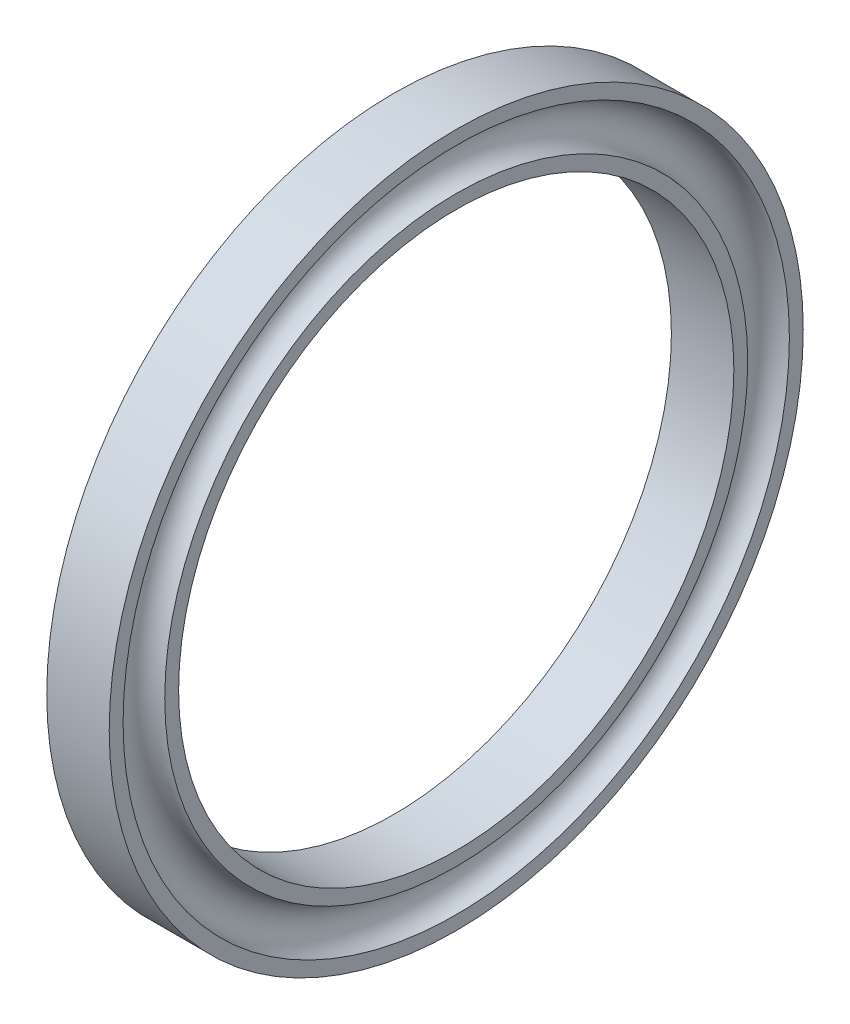
ISO-10303-21;
HEADER;
FILE_DESCRIPTION(('STEP AP214'),'2;1');
FILE_NAME('part.step','',(''),(''),'','','');
FILE_SCHEMA(('AUTOMOTIVE_DESIGN { 1 0 10303 214 1 1 1 1 }'));
ENDSEC;
DATA;
#1=APPLICATION_CONTEXT('core data for automotive mechanical design processes');
#2=APPLICATION_PROTOCOL_DEFINITION('international standard','automotive_design',2000,#1);
#3=PRODUCT_CONTEXT('',#1,'mechanical');
#4=PRODUCT('Part','Part','',(#3));
#5=PRODUCT_RELATED_PRODUCT_CATEGORY('part','',(#4));
#6=PRODUCT_DEFINITION_FORMATION('','',#4);
#7=PRODUCT_DEFINITION_CONTEXT('part definition',#1,'design');
#8=PRODUCT_DEFINITION('design','',#6,#7);
#9=PRODUCT_DEFINITION_SHAPE('','',#8);
#10=(LENGTH_UNIT() NAMED_UNIT(*) SI_UNIT(.MILLI.,.METRE.));
#11=(NAMED_UNIT(*) PLANE_ANGLE_UNIT() SI_UNIT($,.RADIAN.));
#12=(NAMED_UNIT(*) SI_UNIT($,.STERADIAN.) SOLID_ANGLE_UNIT());
#13=UNCERTAINTY_MEASURE_WITH_UNIT(LENGTH_MEASURE(1.E-05),#10,'distance_accuracy_value','');
#14=(GEOMETRIC_REPRESENTATION_CONTEXT(3) GLOBAL_UNCERTAINTY_ASSIGNED_CONTEXT((#13)) GLOBAL_UNIT_ASSIGNED_CONTEXT((#10,
#11,#12)) REPRESENTATION_CONTEXT('',''));
#15=CARTESIAN_POINT('',(0.,0.,0.));
#16=DIRECTION('',(0.,0.,1.));
#17=DIRECTION('',(1.,0.,0.));
#18=AXIS2_PLACEMENT_3D('',#15,#16,#17);
#19=CARTESIAN_POINT('',(-15.8251052884651,-45.8936498877585,0.));
#20=DIRECTION('',(1.,0.,0.));
#21=DIRECTION('',(0.,0.,-1.));
#22=AXIS2_PLACEMENT_3D('',#19,#20,#21);
#23=PLANE('',#22);
#24=CARTESIAN_POINT('',(-15.8251052884651,-70.8936498877585,0.));
#25=DIRECTION('',(1.,0.,0.));
#26=DIRECTION('',(0.,0.,-1.));
#27=AXIS2_PLACEMENT_3D('',#24,#25,#26);
#28=CIRCLE('',#27,25.);
#29=CARTESIAN_POINT('',(-15.8251052884651,-70.8936498877585,-25.));
#30=VERTEX_POINT('',#29);
#31=EDGE_CURVE('E10',#30,#30,#28,.T.);
#32=ORIENTED_EDGE('',*,*,#31,.T.);
#33=EDGE_LOOP('',(#32));
#34=FACE_BOUND('',#33,.T.);
#35=CARTESIAN_POINT('',(-15.8251052884651,-70.8936498877585,0.));
#36=DIRECTION('',(1.,0.,0.));
#37=DIRECTION('',(0.,0.,-1.));
#38=AXIS2_PLACEMENT_3D('',#35,#36,#37);
#39=CIRCLE('',#38,24.);
#40=CARTESIAN_POINT('',(-15.8251052884651,-70.8936498877585,-24.));
#41=VERTEX_POINT('',#40);
#42=EDGE_CURVE('E65',#41,#41,#39,.T.);
#43=ORIENTED_EDGE('',*,*,#42,.F.);
#44=EDGE_LOOP('',(#43));
#45=FACE_BOUND('',#44,.T.);
#46=ADVANCED_FACE('F37',(#34,#45),#23,.T.);
#47=CARTESIAN_POINT('',(19.5311318422865,-70.8936498877585,0.));
#48=DIRECTION('',(1.,0.,0.));
#49=DIRECTION('',(0.,0.,-1.));
#50=AXIS2_PLACEMENT_3D('',#47,#48,#49);
#51=CYLINDRICAL_SURFACE('',#50,25.);
#52=CARTESIAN_POINT('',(-20.3251052884651,-70.8936498877585,0.));
#53=DIRECTION('',(1.,0.,0.));
#54=DIRECTION('',(0.,0.,-1.));
#55=AXIS2_PLACEMENT_3D('',#52,#53,#54);
#56=CIRCLE('',#55,25.);
#57=CARTESIAN_POINT('',(-20.3251052884651,-70.8936498877585,-25.));
#58=VERTEX_POINT('',#57);
#59=EDGE_CURVE('E43',#58,#58,#56,.T.);
#60=ORIENTED_EDGE('',*,*,#59,.T.);
#61=EDGE_LOOP('',(#60));
#62=FACE_BOUND('',#61,.T.);
#63=ORIENTED_EDGE('',*,*,#31,.F.);
#64=EDGE_LOOP('',(#63));
#65=FACE_BOUND('',#64,.T.);
#66=ADVANCED_FACE('F73',(#62,#65),#51,.T.);
#67=CARTESIAN_POINT('',(-20.3251052884651,-45.8936498877585,0.));
#68=DIRECTION('',(-1.,0.,0.));
#69=DIRECTION('',(0.,0.,1.));
#70=AXIS2_PLACEMENT_3D('',#67,#68,#69);
#71=PLANE('',#70);
#72=CARTESIAN_POINT('',(-20.3251052884651,-70.8936498877585,0.));
#73=DIRECTION('',(1.,0.,0.));
#74=DIRECTION('',(0.,0.,-1.));
#75=AXIS2_PLACEMENT_3D('',#72,#73,#74);
#76=CIRCLE('',#75,24.);
#77=CARTESIAN_POINT('',(-20.3251052884651,-70.8936498877585,-24.));
#78=VERTEX_POINT('',#77);
#79=EDGE_CURVE('E47',#78,#78,#76,.T.);
#80=ORIENTED_EDGE('',*,*,#79,.T.);
#81=EDGE_LOOP('',(#80));
#82=FACE_BOUND('',#81,.T.);
#83=ORIENTED_EDGE('',*,*,#59,.F.);
#84=EDGE_LOOP('',(#83));
#85=FACE_BOUND('',#84,.T.);
#86=ADVANCED_FACE('F77',(#82,#85),#71,.T.);
#87=CARTESIAN_POINT('',(-20.3251052884651,-70.8936498877585,0.));
#88=DIRECTION('',(1.,0.,0.));
#89=DIRECTION('',(0.,0.,-1.));
#90=AXIS2_PLACEMENT_3D('',#87,#88,#89);
#91=TOROIDAL_SURFACE('',#90,22.5,1.5);
#92=CARTESIAN_POINT('',(-20.3251052884651,-70.8936498877585,0.));
#93=DIRECTION('',(1.,0.,0.));
#94=DIRECTION('',(0.,0.,-1.));
#95=AXIS2_PLACEMENT_3D('',#92,#93,#94);
#96=CIRCLE('',#95,21.);
#97=CARTESIAN_POINT('',(-20.3251052884651,-70.8936498877585,-21.));
#98=VERTEX_POINT('',#97);
#99=EDGE_CURVE('E51',#98,#98,#96,.T.);
#100=ORIENTED_EDGE('',*,*,#99,.T.);
#101=EDGE_LOOP('',(#100));
#102=FACE_BOUND('',#101,.T.);
#103=ORIENTED_EDGE('',*,*,#79,.F.);
#104=EDGE_LOOP('',(#103));
#105=FACE_BOUND('',#104,.T.);
#106=ADVANCED_FACE('F81',(#102,#105),#91,.F.);
#107=CARTESIAN_POINT('',(-20.3251052884651,-49.8936498877585,0.));
#108=DIRECTION('',(-1.,0.,0.));
#109=DIRECTION('',(0.,0.,1.));
#110=AXIS2_PLACEMENT_3D('',#107,#108,#109);
#111=PLANE('',#110);
#112=CARTESIAN_POINT('',(-20.3251052884651,-70.8936498877585,0.));
#113=DIRECTION('',(1.,0.,0.));
#114=DIRECTION('',(0.,0.,-1.));
#115=AXIS2_PLACEMENT_3D('',#112,#113,#114);
#116=CIRCLE('',#115,20.);
#117=CARTESIAN_POINT('',(-20.3251052884651,-70.8936498877585,-20.));
#118=VERTEX_POINT('',#117);
#119=EDGE_CURVE('E56',#118,#118,#116,.T.);
#120=ORIENTED_EDGE('',*,*,#119,.T.);
#121=EDGE_LOOP('',(#120));
#122=FACE_BOUND('',#121,.T.);
#123=ORIENTED_EDGE('',*,*,#99,.F.);
#124=EDGE_LOOP('',(#123));
#125=FACE_BOUND('',#124,.T.);
#126=ADVANCED_FACE('F88',(#122,#125),#111,.T.);
#127=CARTESIAN_POINT('',(19.5311318422865,-70.8936498877585,0.));
#128=DIRECTION('',(1.,0.,0.));
#129=DIRECTION('',(0.,0.,-1.));
#130=AXIS2_PLACEMENT_3D('',#127,#128,#129);
#131=CYLINDRICAL_SURFACE('',#130,20.);
#132=CARTESIAN_POINT('',(-15.8251052884651,-70.8936498877585,0.));
#133=DIRECTION('',(1.,0.,0.));
#134=DIRECTION('',(0.,0.,-1.));
#135=AXIS2_PLACEMENT_3D('',#132,#133,#134);
#136=CIRCLE('',#135,20.);
#137=CARTESIAN_POINT('',(-15.8251052884651,-70.8936498877585,-20.));
#138=VERTEX_POINT('',#137);
#139=EDGE_CURVE('E59',#138,#138,#136,.T.);
#140=ORIENTED_EDGE('',*,*,#139,.T.);
#141=EDGE_LOOP('',(#140));
#142=FACE_BOUND('',#141,.T.);
#143=ORIENTED_EDGE('',*,*,#119,.F.);
#144=EDGE_LOOP('',(#143));
#145=FACE_BOUND('',#144,.T.);
#146=ADVANCED_FACE('F92',(#142,#145),#131,.F.);
#147=CARTESIAN_POINT('',(-15.8251052884651,-49.8936498877585,0.));
#148=DIRECTION('',(1.,0.,0.));
#149=DIRECTION('',(0.,0.,-1.));
#150=AXIS2_PLACEMENT_3D('',#147,#148,#149);
#151=PLANE('',#150);
#152=CARTESIAN_POINT('',(-15.8251052884651,-70.8936498877585,0.));
#153=DIRECTION('',(1.,0.,0.));
#154=DIRECTION('',(0.,0.,-1.));
#155=AXIS2_PLACEMENT_3D('',#152,#153,#154);
#156=CIRCLE('',#155,21.);
#157=CARTESIAN_POINT('',(-15.8251052884651,-70.8936498877585,-21.));
#158=VERTEX_POINT('',#157);
#159=EDGE_CURVE('E62',#158,#158,#156,.T.);
#160=ORIENTED_EDGE('',*,*,#159,.T.);
#161=EDGE_LOOP('',(#160));
#162=FACE_BOUND('',#161,.T.);
#163=ORIENTED_EDGE('',*,*,#139,.F.);
#164=EDGE_LOOP('',(#163));
#165=FACE_BOUND('',#164,.T.);
#166=ADVANCED_FACE('F96',(#162,#165),#151,.T.);
#167=CARTESIAN_POINT('',(-15.8251052884651,-70.8936498877585,0.));
#168=DIRECTION('',(1.,0.,0.));
#169=DIRECTION('',(0.,0.,-1.));
#170=AXIS2_PLACEMENT_3D('',#167,#168,#169);
#171=TOROIDAL_SURFACE('',#170,22.5,1.5);
#172=ORIENTED_EDGE('',*,*,#42,.T.);
#173=EDGE_LOOP('',(#172));
#174=FACE_BOUND('',#173,.T.);
#175=ORIENTED_EDGE('',*,*,#159,.F.);
#176=EDGE_LOOP('',(#175));
#177=FACE_BOUND('',#176,.T.);
#178=ADVANCED_FACE('F69',(#174,#177),#171,.F.);
#179=CLOSED_SHELL('',(#46,#66,#86,#106,#126,#146,#166,#178));
#180=MANIFOLD_SOLID_BREP('B2',#179);
#181=ADVANCED_BREP_SHAPE_REPRESENTATION('',(#18,#180),#14);
#182=SHAPE_DEFINITION_REPRESENTATION(#9,#181);
ENDSEC;
END-ISO-10303-21;
